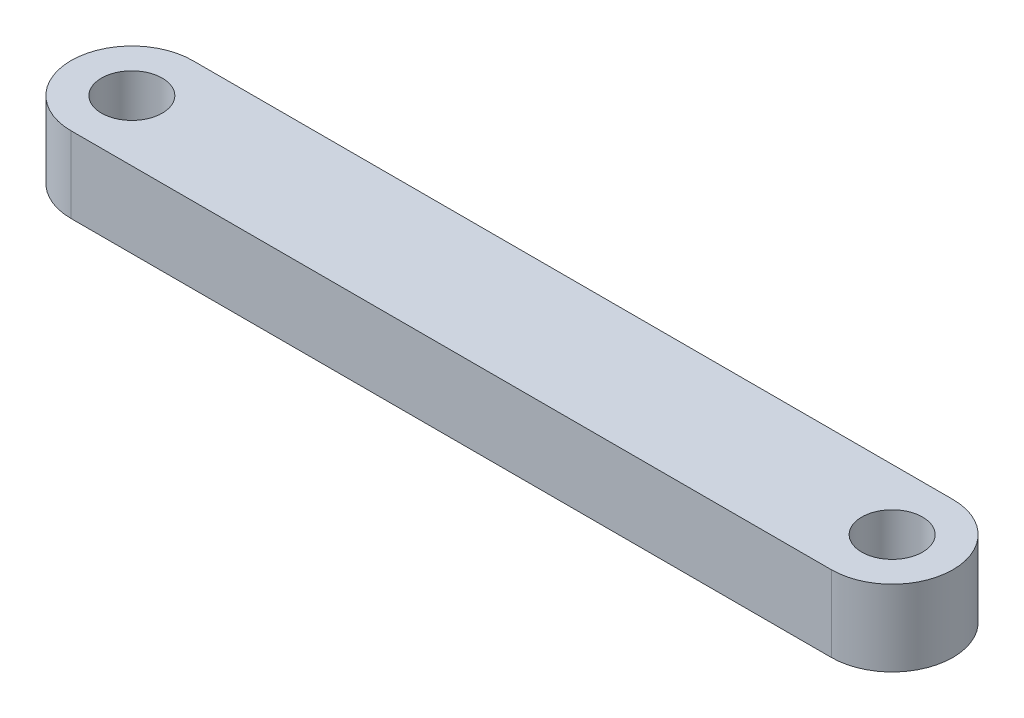
ISO-10303-21;
HEADER;
FILE_DESCRIPTION(('STEP AP214'),'2;1');
FILE_NAME('part.step','',(''),(''),'','','');
FILE_SCHEMA(('AUTOMOTIVE_DESIGN { 1 0 10303 214 1 1 1 1 }'));
ENDSEC;
DATA;
#1=APPLICATION_CONTEXT('core data for automotive mechanical design processes');
#2=APPLICATION_PROTOCOL_DEFINITION('international standard','automotive_design',2000,#1);
#3=PRODUCT_CONTEXT('',#1,'mechanical');
#4=PRODUCT('Part','Part','',(#3));
#5=PRODUCT_RELATED_PRODUCT_CATEGORY('part','',(#4));
#6=PRODUCT_DEFINITION_FORMATION('','',#4);
#7=PRODUCT_DEFINITION_CONTEXT('part definition',#1,'design');
#8=PRODUCT_DEFINITION('design','',#6,#7);
#9=PRODUCT_DEFINITION_SHAPE('','',#8);
#10=(LENGTH_UNIT() NAMED_UNIT(*) SI_UNIT(.MILLI.,.METRE.));
#11=(NAMED_UNIT(*) PLANE_ANGLE_UNIT() SI_UNIT($,.RADIAN.));
#12=(NAMED_UNIT(*) SI_UNIT($,.STERADIAN.) SOLID_ANGLE_UNIT());
#13=UNCERTAINTY_MEASURE_WITH_UNIT(LENGTH_MEASURE(1.E-05),#10,'distance_accuracy_value','');
#14=(GEOMETRIC_REPRESENTATION_CONTEXT(3) GLOBAL_UNCERTAINTY_ASSIGNED_CONTEXT((#13)) GLOBAL_UNIT_ASSIGNED_CONTEXT((#10,
#11,#12)) REPRESENTATION_CONTEXT('',''));
#15=CARTESIAN_POINT('',(0.,0.,0.));
#16=DIRECTION('',(0.,0.,1.));
#17=DIRECTION('',(1.,0.,0.));
#18=AXIS2_PLACEMENT_3D('',#15,#16,#17);
#19=CARTESIAN_POINT('',(-25.,5.,0.));
#20=DIRECTION('',(0.,1.,0.));
#21=DIRECTION('',(0.,0.,1.));
#22=AXIS2_PLACEMENT_3D('',#19,#20,#21);
#23=PLANE('',#22);
#24=CARTESIAN_POINT('',(-25.,5.,0.));
#25=DIRECTION('',(0.,1.,0.));
#26=DIRECTION('',(0.,0.,1.));
#27=AXIS2_PLACEMENT_3D('',#24,#25,#26);
#28=CIRCLE('',#27,2.);
#29=CARTESIAN_POINT('',(-25.,5.,2.));
#30=VERTEX_POINT('',#29);
#31=EDGE_CURVE('E104',#30,#30,#28,.T.);
#32=ORIENTED_EDGE('',*,*,#31,.F.);
#33=EDGE_LOOP('',(#32));
#34=FACE_BOUND('',#33,.T.);
#35=CARTESIAN_POINT('',(-25.,5.,0.));
#36=DIRECTION('',(0.,1.,0.));
#37=DIRECTION('',(0.,0.,1.));
#38=AXIS2_PLACEMENT_3D('',#35,#36,#37);
#39=CIRCLE('',#38,4.00000000000001);
#40=CARTESIAN_POINT('',(-25.,5.,-4.00000000000001));
#41=VERTEX_POINT('',#40);
#42=CARTESIAN_POINT('',(-25.,5.,4.00000000000001));
#43=VERTEX_POINT('',#42);
#44=EDGE_CURVE('E89',#41,#43,#39,.T.);
#45=ORIENTED_EDGE('',*,*,#44,.T.);
#46=DIRECTION('',(1.,0.,0.));
#47=VECTOR('',#46,1.);
#48=CARTESIAN_POINT('',(-25.,5.,4.00000000000001));
#49=LINE('',#48,#47);
#50=CARTESIAN_POINT('',(25.,5.,4.));
#51=VERTEX_POINT('',#50);
#52=EDGE_CURVE('E84',#43,#51,#49,.T.);
#53=ORIENTED_EDGE('',*,*,#52,.T.);
#54=CARTESIAN_POINT('',(25.,5.,0.));
#55=DIRECTION('',(0.,1.,0.));
#56=DIRECTION('',(0.,0.,1.));
#57=AXIS2_PLACEMENT_3D('',#54,#55,#56);
#58=CIRCLE('',#57,4.00000000000001);
#59=CARTESIAN_POINT('',(25.,5.,-4.00000000000002));
#60=VERTEX_POINT('',#59);
#61=EDGE_CURVE('E87',#51,#60,#58,.T.);
#62=ORIENTED_EDGE('',*,*,#61,.T.);
#63=DIRECTION('',(-1.,0.,0.));
#64=VECTOR('',#63,1.);
#65=CARTESIAN_POINT('',(-25.,5.,-4.00000000000001));
#66=LINE('',#65,#64);
#67=EDGE_CURVE('E54',#60,#41,#66,.T.);
#68=ORIENTED_EDGE('',*,*,#67,.T.);
#69=EDGE_LOOP('',(#45,#53,#62,#68));
#70=FACE_BOUND('',#69,.T.);
#71=CARTESIAN_POINT('',(25.,5.,0.));
#72=DIRECTION('',(0.,1.,0.));
#73=DIRECTION('',(0.,0.,1.));
#74=AXIS2_PLACEMENT_3D('',#71,#72,#73);
#75=CIRCLE('',#74,2.);
#76=CARTESIAN_POINT('',(25.,5.,1.99999999999999));
#77=VERTEX_POINT('',#76);
#78=EDGE_CURVE('E119',#77,#77,#75,.T.);
#79=ORIENTED_EDGE('',*,*,#78,.F.);
#80=EDGE_LOOP('',(#79));
#81=FACE_BOUND('',#80,.T.);
#82=ADVANCED_FACE('F37',(#34,#70,#81),#23,.T.);
#83=CARTESIAN_POINT('',(-25.,0.,0.));
#84=DIRECTION('',(0.,1.,0.));
#85=DIRECTION('',(0.,0.,1.));
#86=AXIS2_PLACEMENT_3D('',#83,#84,#85);
#87=PLANE('',#86);
#88=CARTESIAN_POINT('',(-25.,0.,0.));
#89=DIRECTION('',(0.,1.,0.));
#90=DIRECTION('',(0.,0.,1.));
#91=AXIS2_PLACEMENT_3D('',#88,#89,#90);
#92=CIRCLE('',#91,4.00000000000001);
#93=CARTESIAN_POINT('',(-25.,0.,-4.00000000000001));
#94=VERTEX_POINT('',#93);
#95=CARTESIAN_POINT('',(-25.,0.,4.00000000000001));
#96=VERTEX_POINT('',#95);
#97=EDGE_CURVE('E101',#94,#96,#92,.T.);
#98=ORIENTED_EDGE('',*,*,#97,.F.);
#99=DIRECTION('',(-1.,0.,0.));
#100=VECTOR('',#99,1.);
#101=CARTESIAN_POINT('',(-25.,0.,-4.00000000000001));
#102=LINE('',#101,#100);
#103=CARTESIAN_POINT('',(25.,0.,-4.00000000000002));
#104=VERTEX_POINT('',#103);
#105=EDGE_CURVE('E77',#104,#94,#102,.T.);
#106=ORIENTED_EDGE('',*,*,#105,.F.);
#107=CARTESIAN_POINT('',(25.,0.,0.));
#108=DIRECTION('',(0.,1.,0.));
#109=DIRECTION('',(0.,0.,1.));
#110=AXIS2_PLACEMENT_3D('',#107,#108,#109);
#111=CIRCLE('',#110,4.00000000000001);
#112=CARTESIAN_POINT('',(25.,0.,4.));
#113=VERTEX_POINT('',#112);
#114=EDGE_CURVE('E71',#113,#104,#111,.T.);
#115=ORIENTED_EDGE('',*,*,#114,.F.);
#116=DIRECTION('',(1.,0.,0.));
#117=VECTOR('',#116,1.);
#118=CARTESIAN_POINT('',(-25.,0.,4.00000000000001));
#119=LINE('',#118,#117);
#120=EDGE_CURVE('E93',#96,#113,#119,.T.);
#121=ORIENTED_EDGE('',*,*,#120,.F.);
#122=EDGE_LOOP('',(#98,#106,#115,#121));
#123=FACE_BOUND('',#122,.T.);
#124=CARTESIAN_POINT('',(-25.,0.,0.));
#125=DIRECTION('',(0.,1.,0.));
#126=DIRECTION('',(0.,0.,1.));
#127=AXIS2_PLACEMENT_3D('',#124,#125,#126);
#128=CIRCLE('',#127,2.);
#129=CARTESIAN_POINT('',(-25.,0.,2.));
#130=VERTEX_POINT('',#129);
#131=EDGE_CURVE('E116',#130,#130,#128,.T.);
#132=ORIENTED_EDGE('',*,*,#131,.T.);
#133=EDGE_LOOP('',(#132));
#134=FACE_BOUND('',#133,.T.);
#135=CARTESIAN_POINT('',(25.,0.,0.));
#136=DIRECTION('',(0.,1.,0.));
#137=DIRECTION('',(0.,0.,1.));
#138=AXIS2_PLACEMENT_3D('',#135,#136,#137);
#139=CIRCLE('',#138,2.);
#140=CARTESIAN_POINT('',(25.,0.,1.99999999999999));
#141=VERTEX_POINT('',#140);
#142=EDGE_CURVE('E122',#141,#141,#139,.T.);
#143=ORIENTED_EDGE('',*,*,#142,.T.);
#144=EDGE_LOOP('',(#143));
#145=FACE_BOUND('',#144,.T.);
#146=ADVANCED_FACE('F112',(#123,#134,#145),#87,.F.);
#147=CARTESIAN_POINT('',(-25.,5.,0.));
#148=DIRECTION('',(0.,-1.,0.));
#149=DIRECTION('',(0.,0.,-1.));
#150=AXIS2_PLACEMENT_3D('',#147,#148,#149);
#151=CYLINDRICAL_SURFACE('',#150,4.00000000000001);
#152=ORIENTED_EDGE('',*,*,#97,.T.);
#153=DIRECTION('',(0.,-1.,0.));
#154=VECTOR('',#153,1.);
#155=CARTESIAN_POINT('',(-25.,5.,4.00000000000001));
#156=LINE('',#155,#154);
#157=EDGE_CURVE('E11',#43,#96,#156,.T.);
#158=ORIENTED_EDGE('',*,*,#157,.F.);
#159=ORIENTED_EDGE('',*,*,#44,.F.);
#160=DIRECTION('',(0.,-1.,0.));
#161=VECTOR('',#160,1.);
#162=CARTESIAN_POINT('',(-25.,5.,-4.00000000000001));
#163=LINE('',#162,#161);
#164=EDGE_CURVE('E97',#41,#94,#163,.T.);
#165=ORIENTED_EDGE('',*,*,#164,.T.);
#166=EDGE_LOOP('',(#152,#158,#159,#165));
#167=FACE_BOUND('',#166,.T.);
#168=ADVANCED_FACE('F39',(#167),#151,.T.);
#169=CARTESIAN_POINT('',(-25.,5.,4.00000000000001));
#170=DIRECTION('',(0.,0.,-1.));
#171=DIRECTION('',(-1.,0.,0.));
#172=AXIS2_PLACEMENT_3D('',#169,#170,#171);
#173=PLANE('',#172);
#174=ORIENTED_EDGE('',*,*,#120,.T.);
#175=DIRECTION('',(0.,-1.,0.));
#176=VECTOR('',#175,1.);
#177=CARTESIAN_POINT('',(25.,5.,4.));
#178=LINE('',#177,#176);
#179=EDGE_CURVE('E46',#51,#113,#178,.T.);
#180=ORIENTED_EDGE('',*,*,#179,.F.);
#181=ORIENTED_EDGE('',*,*,#52,.F.);
#182=ORIENTED_EDGE('',*,*,#157,.T.);
#183=EDGE_LOOP('',(#174,#180,#181,#182));
#184=FACE_BOUND('',#183,.T.);
#185=ADVANCED_FACE('F92',(#184),#173,.F.);
#186=CARTESIAN_POINT('',(25.,5.,0.));
#187=DIRECTION('',(0.,-1.,0.));
#188=DIRECTION('',(0.,0.,-1.));
#189=AXIS2_PLACEMENT_3D('',#186,#187,#188);
#190=CYLINDRICAL_SURFACE('',#189,4.00000000000001);
#191=ORIENTED_EDGE('',*,*,#114,.T.);
#192=DIRECTION('',(0.,-1.,0.));
#193=VECTOR('',#192,1.);
#194=CARTESIAN_POINT('',(25.,5.,-4.00000000000002));
#195=LINE('',#194,#193);
#196=EDGE_CURVE('E94',#60,#104,#195,.T.);
#197=ORIENTED_EDGE('',*,*,#196,.F.);
#198=ORIENTED_EDGE('',*,*,#61,.F.);
#199=ORIENTED_EDGE('',*,*,#179,.T.);
#200=EDGE_LOOP('',(#191,#197,#198,#199));
#201=FACE_BOUND('',#200,.T.);
#202=ADVANCED_FACE('F95',(#201),#190,.T.);
#203=CARTESIAN_POINT('',(-25.,5.,-4.00000000000001));
#204=DIRECTION('',(0.,0.,1.));
#205=DIRECTION('',(1.,0.,0.));
#206=AXIS2_PLACEMENT_3D('',#203,#204,#205);
#207=PLANE('',#206);
#208=ORIENTED_EDGE('',*,*,#105,.T.);
#209=ORIENTED_EDGE('',*,*,#164,.F.);
#210=ORIENTED_EDGE('',*,*,#67,.F.);
#211=ORIENTED_EDGE('',*,*,#196,.T.);
#212=EDGE_LOOP('',(#208,#209,#210,#211));
#213=FACE_BOUND('',#212,.T.);
#214=ADVANCED_FACE('F109',(#213),#207,.F.);
#215=CARTESIAN_POINT('',(-25.,5.,0.));
#216=DIRECTION('',(0.,-1.,0.));
#217=DIRECTION('',(0.,0.,-1.));
#218=AXIS2_PLACEMENT_3D('',#215,#216,#217);
#219=CYLINDRICAL_SURFACE('',#218,2.);
#220=ORIENTED_EDGE('',*,*,#31,.T.);
#221=EDGE_LOOP('',(#220));
#222=FACE_BOUND('',#221,.T.);
#223=ORIENTED_EDGE('',*,*,#131,.F.);
#224=EDGE_LOOP('',(#223));
#225=FACE_BOUND('',#224,.T.);
#226=ADVANCED_FACE('F139',(#222,#225),#219,.F.);
#227=CARTESIAN_POINT('',(25.,5.,0.));
#228=DIRECTION('',(0.,-1.,0.));
#229=DIRECTION('',(0.,0.,-1.));
#230=AXIS2_PLACEMENT_3D('',#227,#228,#229);
#231=CYLINDRICAL_SURFACE('',#230,2.);
#232=ORIENTED_EDGE('',*,*,#78,.T.);
#233=EDGE_LOOP('',(#232));
#234=FACE_BOUND('',#233,.T.);
#235=ORIENTED_EDGE('',*,*,#142,.F.);
#236=EDGE_LOOP('',(#235));
#237=FACE_BOUND('',#236,.T.);
#238=ADVANCED_FACE('F128',(#234,#237),#231,.F.);
#239=CLOSED_SHELL('',(#82,#146,#168,#185,#202,#214,#226,#238));
#240=MANIFOLD_SOLID_BREP('B2',#239);
#241=ADVANCED_BREP_SHAPE_REPRESENTATION('',(#18,#240),#14);
#242=SHAPE_DEFINITION_REPRESENTATION(#9,#241);
ENDSEC;
END-ISO-10303-21;
